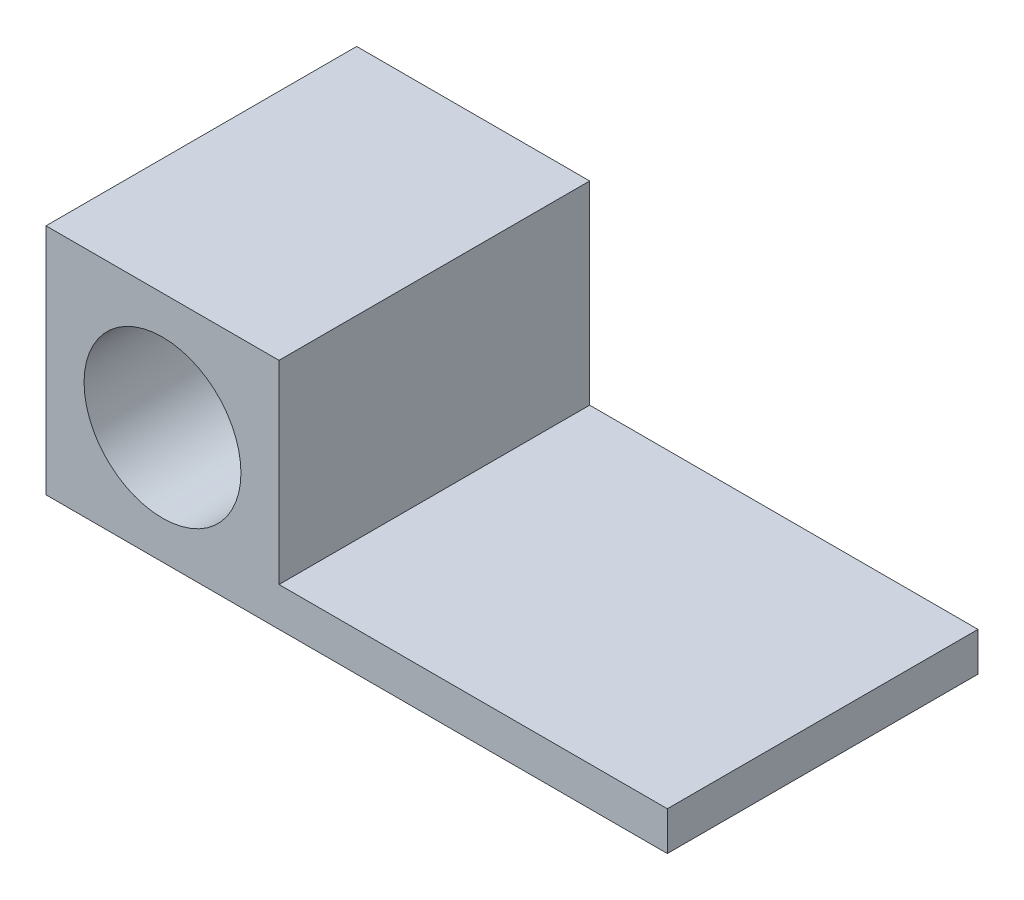
ISO-10303-21;
HEADER;
FILE_DESCRIPTION(('STEP AP214'),'2;1');
FILE_NAME('part.step','',(''),(''),'','','');
FILE_SCHEMA(('AUTOMOTIVE_DESIGN { 1 0 10303 214 1 1 1 1 }'));
ENDSEC;
DATA;
#1=APPLICATION_CONTEXT('core data for automotive mechanical design processes');
#2=APPLICATION_PROTOCOL_DEFINITION('international standard','automotive_design',2000,#1);
#3=PRODUCT_CONTEXT('',#1,'mechanical');
#4=PRODUCT('Part','Part','',(#3));
#5=PRODUCT_RELATED_PRODUCT_CATEGORY('part','',(#4));
#6=PRODUCT_DEFINITION_FORMATION('','',#4);
#7=PRODUCT_DEFINITION_CONTEXT('part definition',#1,'design');
#8=PRODUCT_DEFINITION('design','',#6,#7);
#9=PRODUCT_DEFINITION_SHAPE('','',#8);
#10=(LENGTH_UNIT() NAMED_UNIT(*) SI_UNIT(.MILLI.,.METRE.));
#11=(NAMED_UNIT(*) PLANE_ANGLE_UNIT() SI_UNIT($,.RADIAN.));
#12=(NAMED_UNIT(*) SI_UNIT($,.STERADIAN.) SOLID_ANGLE_UNIT());
#13=UNCERTAINTY_MEASURE_WITH_UNIT(LENGTH_MEASURE(1.E-05),#10,'distance_accuracy_value','');
#14=(GEOMETRIC_REPRESENTATION_CONTEXT(3) GLOBAL_UNCERTAINTY_ASSIGNED_CONTEXT((#13)) GLOBAL_UNIT_ASSIGNED_CONTEXT((#10,
#11,#12)) REPRESENTATION_CONTEXT('',''));
#15=CARTESIAN_POINT('',(0.,0.,0.));
#16=DIRECTION('',(0.,0.,1.));
#17=DIRECTION('',(1.,0.,0.));
#18=AXIS2_PLACEMENT_3D('',#15,#16,#17);
#19=CARTESIAN_POINT('',(145.,2.5,0.));
#20=DIRECTION('',(0.,1.,0.));
#21=DIRECTION('',(1.,0.,0.));
#22=AXIS2_PLACEMENT_3D('',#19,#20,#21);
#23=PLANE('',#22);
#24=DIRECTION('',(-1.,0.,0.));
#25=VECTOR('',#24,1.);
#26=CARTESIAN_POINT('',(145.,2.5,0.));
#27=LINE('',#26,#25);
#28=CARTESIAN_POINT('',(145.,2.5,0.));
#29=VERTEX_POINT('',#28);
#30=CARTESIAN_POINT('',(120.,2.5,0.));
#31=VERTEX_POINT('',#30);
#32=EDGE_CURVE('E183',#29,#31,#27,.T.);
#33=ORIENTED_EDGE('',*,*,#32,.T.);
#34=DIRECTION('',(0.,0.,-1.));
#35=VECTOR('',#34,1.);
#36=CARTESIAN_POINT('',(120.,2.5,20.));
#37=LINE('',#36,#35);
#38=CARTESIAN_POINT('',(120.,2.5,20.));
#39=VERTEX_POINT('',#38);
#40=EDGE_CURVE('E51',#39,#31,#37,.T.);
#41=ORIENTED_EDGE('',*,*,#40,.F.);
#42=DIRECTION('',(-1.,0.,0.));
#43=VECTOR('',#42,1.);
#44=CARTESIAN_POINT('',(145.,2.5,20.));
#45=LINE('',#44,#43);
#46=CARTESIAN_POINT('',(145.,2.5,20.));
#47=VERTEX_POINT('',#46);
#48=EDGE_CURVE('E129',#47,#39,#45,.T.);
#49=ORIENTED_EDGE('',*,*,#48,.F.);
#50=DIRECTION('',(0.,0.,1.));
#51=VECTOR('',#50,1.);
#52=CARTESIAN_POINT('',(145.,2.5,0.));
#53=LINE('',#52,#51);
#54=EDGE_CURVE('E11',#29,#47,#53,.T.);
#55=ORIENTED_EDGE('',*,*,#54,.F.);
#56=EDGE_LOOP('',(#33,#41,#49,#55));
#57=FACE_BOUND('',#56,.T.);
#58=ADVANCED_FACE('F40',(#57),#23,.T.);
#59=CARTESIAN_POINT('',(145.,0.,0.));
#60=DIRECTION('',(1.,0.,0.));
#61=DIRECTION('',(0.,1.,0.));
#62=AXIS2_PLACEMENT_3D('',#59,#60,#61);
#63=PLANE('',#62);
#64=DIRECTION('',(0.,1.,0.));
#65=VECTOR('',#64,1.);
#66=CARTESIAN_POINT('',(145.,0.,0.));
#67=LINE('',#66,#65);
#68=CARTESIAN_POINT('',(145.,0.,0.));
#69=VERTEX_POINT('',#68);
#70=EDGE_CURVE('E159',#69,#29,#67,.T.);
#71=ORIENTED_EDGE('',*,*,#70,.T.);
#72=ORIENTED_EDGE('',*,*,#54,.T.);
#73=DIRECTION('',(0.,1.,0.));
#74=VECTOR('',#73,1.);
#75=CARTESIAN_POINT('',(145.,0.,20.));
#76=LINE('',#75,#74);
#77=CARTESIAN_POINT('',(145.,0.,20.));
#78=VERTEX_POINT('',#77);
#79=EDGE_CURVE('E118',#78,#47,#76,.T.);
#80=ORIENTED_EDGE('',*,*,#79,.F.);
#81=DIRECTION('',(0.,0.,1.));
#82=VECTOR('',#81,1.);
#83=CARTESIAN_POINT('',(145.,0.,0.));
#84=LINE('',#83,#82);
#85=EDGE_CURVE('E123',#69,#78,#84,.T.);
#86=ORIENTED_EDGE('',*,*,#85,.F.);
#87=EDGE_LOOP('',(#71,#72,#80,#86));
#88=FACE_BOUND('',#87,.T.);
#89=ADVANCED_FACE('F121',(#88),#63,.T.);
#90=CARTESIAN_POINT('',(120.,40.,40.));
#91=DIRECTION('',(1.,0.,0.));
#92=DIRECTION('',(0.,1.,0.));
#93=AXIS2_PLACEMENT_3D('',#90,#91,#92);
#94=PLANE('',#93);
#95=DIRECTION('',(0.,0.,1.));
#96=VECTOR('',#95,1.);
#97=CARTESIAN_POINT('',(120.,15.,30.));
#98=LINE('',#97,#96);
#99=CARTESIAN_POINT('',(120.,15.,0.));
#100=VERTEX_POINT('',#99);
#101=CARTESIAN_POINT('',(120.,15.,20.));
#102=VERTEX_POINT('',#101);
#103=EDGE_CURVE('E110',#100,#102,#98,.T.);
#104=ORIENTED_EDGE('',*,*,#103,.T.);
#105=DIRECTION('',(0.,1.,0.));
#106=VECTOR('',#105,1.);
#107=CARTESIAN_POINT('',(120.,15.,20.));
#108=LINE('',#107,#106);
#109=EDGE_CURVE('E154',#39,#102,#108,.T.);
#110=ORIENTED_EDGE('',*,*,#109,.F.);
#111=ORIENTED_EDGE('',*,*,#40,.T.);
#112=DIRECTION('',(0.,-1.,0.));
#113=VECTOR('',#112,1.);
#114=CARTESIAN_POINT('',(120.,0.,0.));
#115=LINE('',#114,#113);
#116=EDGE_CURVE('E185',#100,#31,#115,.T.);
#117=ORIENTED_EDGE('',*,*,#116,.F.);
#118=EDGE_LOOP('',(#104,#110,#111,#117));
#119=FACE_BOUND('',#118,.T.);
#120=ADVANCED_FACE('F215',(#119),#94,.T.);
#121=CARTESIAN_POINT('',(112.5,7.5,20.));
#122=DIRECTION('',(0.,0.,-1.));
#123=DIRECTION('',(-1.,0.,0.));
#124=AXIS2_PLACEMENT_3D('',#121,#122,#123);
#125=CYLINDRICAL_SURFACE('',#124,5.05);
#126=CARTESIAN_POINT('',(112.5,7.5,20.));
#127=DIRECTION('',(0.,0.,-1.));
#128=DIRECTION('',(-1.,0.,0.));
#129=AXIS2_PLACEMENT_3D('',#126,#127,#128);
#130=CIRCLE('',#129,5.05);
#131=CARTESIAN_POINT('',(117.55,7.5,20.));
#132=VERTEX_POINT('',#131);
#133=EDGE_CURVE('E193',#132,#132,#130,.T.);
#134=ORIENTED_EDGE('',*,*,#133,.F.);
#135=DIRECTION('',(0.,0.,-1.));
#136=VECTOR('',#135,1.);
#137=CARTESIAN_POINT('',(117.55,7.5,20.));
#138=LINE('',#137,#136);
#139=CARTESIAN_POINT('',(117.55,7.5,0.));
#140=VERTEX_POINT('',#139);
#141=EDGE_CURVE('E44',#132,#140,#138,.T.);
#142=ORIENTED_EDGE('',*,*,#141,.T.);
#143=CARTESIAN_POINT('',(112.5,7.5,0.));
#144=DIRECTION('',(0.,0.,1.));
#145=DIRECTION('',(-1.,0.,0.));
#146=AXIS2_PLACEMENT_3D('',#143,#144,#145);
#147=CIRCLE('',#146,5.05);
#148=EDGE_CURVE('E155',#140,#140,#147,.T.);
#149=ORIENTED_EDGE('',*,*,#148,.F.);
#150=ORIENTED_EDGE('',*,*,#141,.F.);
#151=EDGE_LOOP('',(#134,#142,#149,#150));
#152=FACE_BOUND('',#151,.T.);
#153=ADVANCED_FACE('F226',(#152),#125,.F.);
#154=CARTESIAN_POINT('',(112.5,7.5,20.));
#155=DIRECTION('',(0.,0.,1.));
#156=DIRECTION('',(1.,0.,0.));
#157=AXIS2_PLACEMENT_3D('',#154,#155,#156);
#158=PLANE('',#157);
#159=ORIENTED_EDGE('',*,*,#133,.T.);
#160=EDGE_LOOP('',(#159));
#161=FACE_BOUND('',#160,.T.);
#162=DIRECTION('',(1.,0.,0.));
#163=VECTOR('',#162,1.);
#164=CARTESIAN_POINT('',(105.,0.,20.));
#165=LINE('',#164,#163);
#166=CARTESIAN_POINT('',(105.,0.,20.));
#167=VERTEX_POINT('',#166);
#168=EDGE_CURVE('E132',#167,#78,#165,.T.);
#169=ORIENTED_EDGE('',*,*,#168,.T.);
#170=ORIENTED_EDGE('',*,*,#79,.T.);
#171=ORIENTED_EDGE('',*,*,#48,.T.);
#172=ORIENTED_EDGE('',*,*,#109,.T.);
#173=DIRECTION('',(1.,0.,0.));
#174=VECTOR('',#173,1.);
#175=CARTESIAN_POINT('',(116.25,15.,20.));
#176=LINE('',#175,#174);
#177=CARTESIAN_POINT('',(105.,15.,20.));
#178=VERTEX_POINT('',#177);
#179=EDGE_CURVE('E158',#178,#102,#176,.T.);
#180=ORIENTED_EDGE('',*,*,#179,.F.);
#181=DIRECTION('',(0.,1.,0.));
#182=VECTOR('',#181,1.);
#183=CARTESIAN_POINT('',(105.,3.75,20.));
#184=LINE('',#183,#182);
#185=EDGE_CURVE('E135',#167,#178,#184,.T.);
#186=ORIENTED_EDGE('',*,*,#185,.F.);
#187=EDGE_LOOP('',(#169,#170,#171,#172,#180,#186));
#188=FACE_BOUND('',#187,.T.);
#189=ADVANCED_FACE('F133',(#161,#188),#158,.T.);
#190=CARTESIAN_POINT('',(80.,15.,20.));
#191=DIRECTION('',(0.,-1.,0.));
#192=DIRECTION('',(0.,0.,-1.));
#193=AXIS2_PLACEMENT_3D('',#190,#191,#192);
#194=PLANE('',#193);
#195=DIRECTION('',(0.,0.,1.));
#196=VECTOR('',#195,1.);
#197=CARTESIAN_POINT('',(105.,15.,20.));
#198=LINE('',#197,#196);
#199=CARTESIAN_POINT('',(105.,15.,0.));
#200=VERTEX_POINT('',#199);
#201=EDGE_CURVE('E170',#200,#178,#198,.T.);
#202=ORIENTED_EDGE('',*,*,#201,.T.);
#203=ORIENTED_EDGE('',*,*,#179,.T.);
#204=ORIENTED_EDGE('',*,*,#103,.F.);
#205=DIRECTION('',(1.,0.,0.));
#206=VECTOR('',#205,1.);
#207=CARTESIAN_POINT('',(70.,15.,0.));
#208=LINE('',#207,#206);
#209=EDGE_CURVE('E140',#200,#100,#208,.T.);
#210=ORIENTED_EDGE('',*,*,#209,.F.);
#211=EDGE_LOOP('',(#202,#203,#204,#210));
#212=FACE_BOUND('',#211,.T.);
#213=ADVANCED_FACE('F42',(#212),#194,.F.);
#214=CARTESIAN_POINT('',(60.,20.,0.));
#215=DIRECTION('',(0.,0.,1.));
#216=DIRECTION('',(1.,0.,0.));
#217=AXIS2_PLACEMENT_3D('',#214,#215,#216);
#218=PLANE('',#217);
#219=ORIENTED_EDGE('',*,*,#148,.T.);
#220=EDGE_LOOP('',(#219));
#221=FACE_BOUND('',#220,.T.);
#222=DIRECTION('',(0.,1.,0.));
#223=VECTOR('',#222,1.);
#224=CARTESIAN_POINT('',(105.,13.75,0.));
#225=LINE('',#224,#223);
#226=CARTESIAN_POINT('',(105.,0.,0.));
#227=VERTEX_POINT('',#226);
#228=EDGE_CURVE('E162',#227,#200,#225,.T.);
#229=ORIENTED_EDGE('',*,*,#228,.T.);
#230=ORIENTED_EDGE('',*,*,#209,.T.);
#231=ORIENTED_EDGE('',*,*,#116,.T.);
#232=ORIENTED_EDGE('',*,*,#32,.F.);
#233=ORIENTED_EDGE('',*,*,#70,.F.);
#234=DIRECTION('',(1.,0.,0.));
#235=VECTOR('',#234,1.);
#236=CARTESIAN_POINT('',(0.,0.,0.));
#237=LINE('',#236,#235);
#238=EDGE_CURVE('E143',#227,#69,#237,.T.);
#239=ORIENTED_EDGE('',*,*,#238,.F.);
#240=EDGE_LOOP('',(#229,#230,#231,#232,#233,#239));
#241=FACE_BOUND('',#240,.T.);
#242=ADVANCED_FACE('F212',(#221,#241),#218,.F.);
#243=CARTESIAN_POINT('',(0.,0.,0.));
#244=DIRECTION('',(0.,-1.,0.));
#245=DIRECTION('',(0.,0.,-1.));
#246=AXIS2_PLACEMENT_3D('',#243,#244,#245);
#247=PLANE('',#246);
#248=DIRECTION('',(0.,0.,-1.));
#249=VECTOR('',#248,1.);
#250=CARTESIAN_POINT('',(105.,0.,10.));
#251=LINE('',#250,#249);
#252=EDGE_CURVE('E160',#167,#227,#251,.T.);
#253=ORIENTED_EDGE('',*,*,#252,.T.);
#254=ORIENTED_EDGE('',*,*,#238,.T.);
#255=ORIENTED_EDGE('',*,*,#85,.T.);
#256=ORIENTED_EDGE('',*,*,#168,.F.);
#257=EDGE_LOOP('',(#253,#254,#255,#256));
#258=FACE_BOUND('',#257,.T.);
#259=ADVANCED_FACE('F142',(#258),#247,.T.);
#260=CARTESIAN_POINT('',(105.,7.5,20.));
#261=DIRECTION('',(1.,0.,0.));
#262=DIRECTION('',(0.,1.,0.));
#263=AXIS2_PLACEMENT_3D('',#260,#261,#262);
#264=PLANE('',#263);
#265=ORIENTED_EDGE('',*,*,#201,.F.);
#266=ORIENTED_EDGE('',*,*,#228,.F.);
#267=ORIENTED_EDGE('',*,*,#252,.F.);
#268=ORIENTED_EDGE('',*,*,#185,.T.);
#269=EDGE_LOOP('',(#265,#266,#267,#268));
#270=FACE_BOUND('',#269,.T.);
#271=ADVANCED_FACE('F207',(#270),#264,.F.);
#272=CLOSED_SHELL('',(#58,#89,#120,#153,#189,#213,#242,#259,#271));
#273=MANIFOLD_SOLID_BREP('B2',#272);
#274=ADVANCED_BREP_SHAPE_REPRESENTATION('',(#18,#273),#14);
#275=SHAPE_DEFINITION_REPRESENTATION(#9,#274);
ENDSEC;
END-ISO-10303-21;
